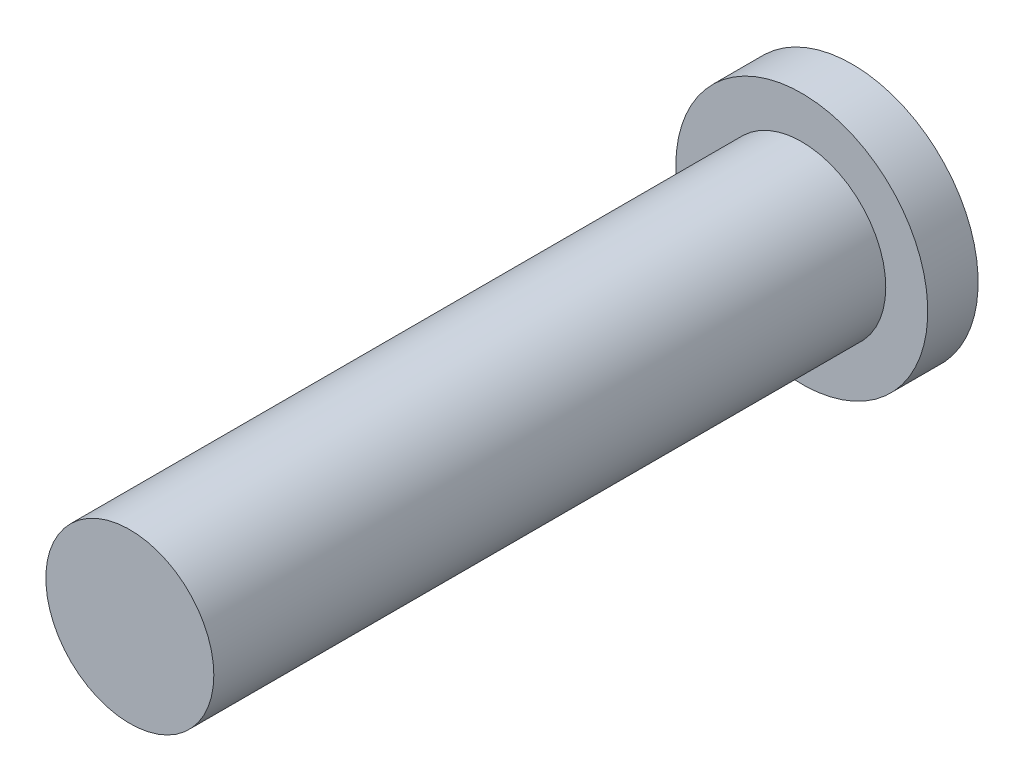
ISO-10303-21;
HEADER;
FILE_DESCRIPTION(('STEP AP214'),'2;1');
FILE_NAME('part.step','',(''),(''),'','','');
FILE_SCHEMA(('AUTOMOTIVE_DESIGN { 1 0 10303 214 1 1 1 1 }'));
ENDSEC;
DATA;
#1=APPLICATION_CONTEXT('core data for automotive mechanical design processes');
#2=APPLICATION_PROTOCOL_DEFINITION('international standard','automotive_design',2000,#1);
#3=PRODUCT_CONTEXT('',#1,'mechanical');
#4=PRODUCT('Part','Part','',(#3));
#5=PRODUCT_RELATED_PRODUCT_CATEGORY('part','',(#4));
#6=PRODUCT_DEFINITION_FORMATION('','',#4);
#7=PRODUCT_DEFINITION_CONTEXT('part definition',#1,'design');
#8=PRODUCT_DEFINITION('design','',#6,#7);
#9=PRODUCT_DEFINITION_SHAPE('','',#8);
#10=(LENGTH_UNIT() NAMED_UNIT(*) SI_UNIT(.MILLI.,.METRE.));
#11=(NAMED_UNIT(*) PLANE_ANGLE_UNIT() SI_UNIT($,.RADIAN.));
#12=(NAMED_UNIT(*) SI_UNIT($,.STERADIAN.) SOLID_ANGLE_UNIT());
#13=UNCERTAINTY_MEASURE_WITH_UNIT(LENGTH_MEASURE(1.E-05),#10,'distance_accuracy_value','');
#14=(GEOMETRIC_REPRESENTATION_CONTEXT(3) GLOBAL_UNCERTAINTY_ASSIGNED_CONTEXT((#13)) GLOBAL_UNIT_ASSIGNED_CONTEXT((#10,
#11,#12)) REPRESENTATION_CONTEXT('',''));
#15=CARTESIAN_POINT('',(0.,0.,0.));
#16=DIRECTION('',(0.,0.,1.));
#17=DIRECTION('',(1.,0.,0.));
#18=AXIS2_PLACEMENT_3D('',#15,#16,#17);
#19=CARTESIAN_POINT('',(0.,0.,40.));
#20=DIRECTION('',(0.,0.,-1.));
#21=DIRECTION('',(-1.,0.,0.));
#22=AXIS2_PLACEMENT_3D('',#19,#20,#21);
#23=CYLINDRICAL_SURFACE('',#22,5.);
#24=CARTESIAN_POINT('',(0.,0.,40.));
#25=DIRECTION('',(0.,0.,1.));
#26=DIRECTION('',(1.,0.,0.));
#27=AXIS2_PLACEMENT_3D('',#24,#25,#26);
#28=CIRCLE('',#27,5.);
#29=CARTESIAN_POINT('',(5.,0.,40.));
#30=VERTEX_POINT('',#29);
#31=EDGE_CURVE('E10',#30,#30,#28,.T.);
#32=ORIENTED_EDGE('',*,*,#31,.F.);
#33=EDGE_LOOP('',(#32));
#34=FACE_BOUND('',#33,.T.);
#35=CARTESIAN_POINT('',(0.,0.,0.));
#36=DIRECTION('',(0.,0.,1.));
#37=DIRECTION('',(1.,0.,0.));
#38=AXIS2_PLACEMENT_3D('',#35,#36,#37);
#39=CIRCLE('',#38,5.);
#40=CARTESIAN_POINT('',(5.,0.,0.));
#41=VERTEX_POINT('',#40);
#42=EDGE_CURVE('E37',#41,#41,#39,.T.);
#43=ORIENTED_EDGE('',*,*,#42,.T.);
#44=EDGE_LOOP('',(#43));
#45=FACE_BOUND('',#44,.T.);
#46=ADVANCED_FACE('F34',(#34,#45),#23,.T.);
#47=CARTESIAN_POINT('',(0.,0.,40.));
#48=DIRECTION('',(0.,0.,1.));
#49=DIRECTION('',(1.,0.,0.));
#50=AXIS2_PLACEMENT_3D('',#47,#48,#49);
#51=PLANE('',#50);
#52=ORIENTED_EDGE('',*,*,#31,.T.);
#53=EDGE_LOOP('',(#52));
#54=FACE_BOUND('',#53,.T.);
#55=ADVANCED_FACE('F57',(#54),#51,.T.);
#56=CARTESIAN_POINT('',(0.,0.,-3.));
#57=DIRECTION('',(0.,0.,1.));
#58=DIRECTION('',(1.,0.,0.));
#59=AXIS2_PLACEMENT_3D('',#56,#57,#58);
#60=CYLINDRICAL_SURFACE('',#59,7.5);
#61=CARTESIAN_POINT('',(0.,0.,-3.));
#62=DIRECTION('',(0.,0.,-1.));
#63=DIRECTION('',(-1.,0.,0.));
#64=AXIS2_PLACEMENT_3D('',#61,#62,#63);
#65=CIRCLE('',#64,7.5);
#66=CARTESIAN_POINT('',(-7.5,0.,-3.));
#67=VERTEX_POINT('',#66);
#68=EDGE_CURVE('E44',#67,#67,#65,.T.);
#69=ORIENTED_EDGE('',*,*,#68,.F.);
#70=EDGE_LOOP('',(#69));
#71=FACE_BOUND('',#70,.T.);
#72=CARTESIAN_POINT('',(0.,0.,0.));
#73=DIRECTION('',(0.,0.,-1.));
#74=DIRECTION('',(-1.,0.,0.));
#75=AXIS2_PLACEMENT_3D('',#72,#73,#74);
#76=CIRCLE('',#75,7.5);
#77=CARTESIAN_POINT('',(-7.5,0.,0.));
#78=VERTEX_POINT('',#77);
#79=EDGE_CURVE('E46',#78,#78,#76,.T.);
#80=ORIENTED_EDGE('',*,*,#79,.T.);
#81=EDGE_LOOP('',(#80));
#82=FACE_BOUND('',#81,.T.);
#83=ADVANCED_FACE('F54',(#71,#82),#60,.T.);
#84=CARTESIAN_POINT('',(0.,0.,-3.));
#85=DIRECTION('',(0.,0.,-1.));
#86=DIRECTION('',(-1.,0.,0.));
#87=AXIS2_PLACEMENT_3D('',#84,#85,#86);
#88=PLANE('',#87);
#89=ORIENTED_EDGE('',*,*,#68,.T.);
#90=EDGE_LOOP('',(#89));
#91=FACE_BOUND('',#90,.T.);
#92=ADVANCED_FACE('F52',(#91),#88,.T.);
#93=CARTESIAN_POINT('',(0.,0.,0.));
#94=DIRECTION('',(0.,0.,-1.));
#95=DIRECTION('',(-1.,0.,0.));
#96=AXIS2_PLACEMENT_3D('',#93,#94,#95);
#97=PLANE('',#96);
#98=ORIENTED_EDGE('',*,*,#42,.F.);
#99=EDGE_LOOP('',(#98));
#100=FACE_BOUND('',#99,.T.);
#101=ORIENTED_EDGE('',*,*,#79,.F.);
#102=EDGE_LOOP('',(#101));
#103=FACE_BOUND('',#102,.T.);
#104=ADVANCED_FACE('F61',(#100,#103),#97,.F.);
#105=CLOSED_SHELL('',(#46,#55,#83,#92,#104));
#106=MANIFOLD_SOLID_BREP('B2',#105);
#107=ADVANCED_BREP_SHAPE_REPRESENTATION('',(#18,#106),#14);
#108=SHAPE_DEFINITION_REPRESENTATION(#9,#107);
ENDSEC;
END-ISO-10303-21;
